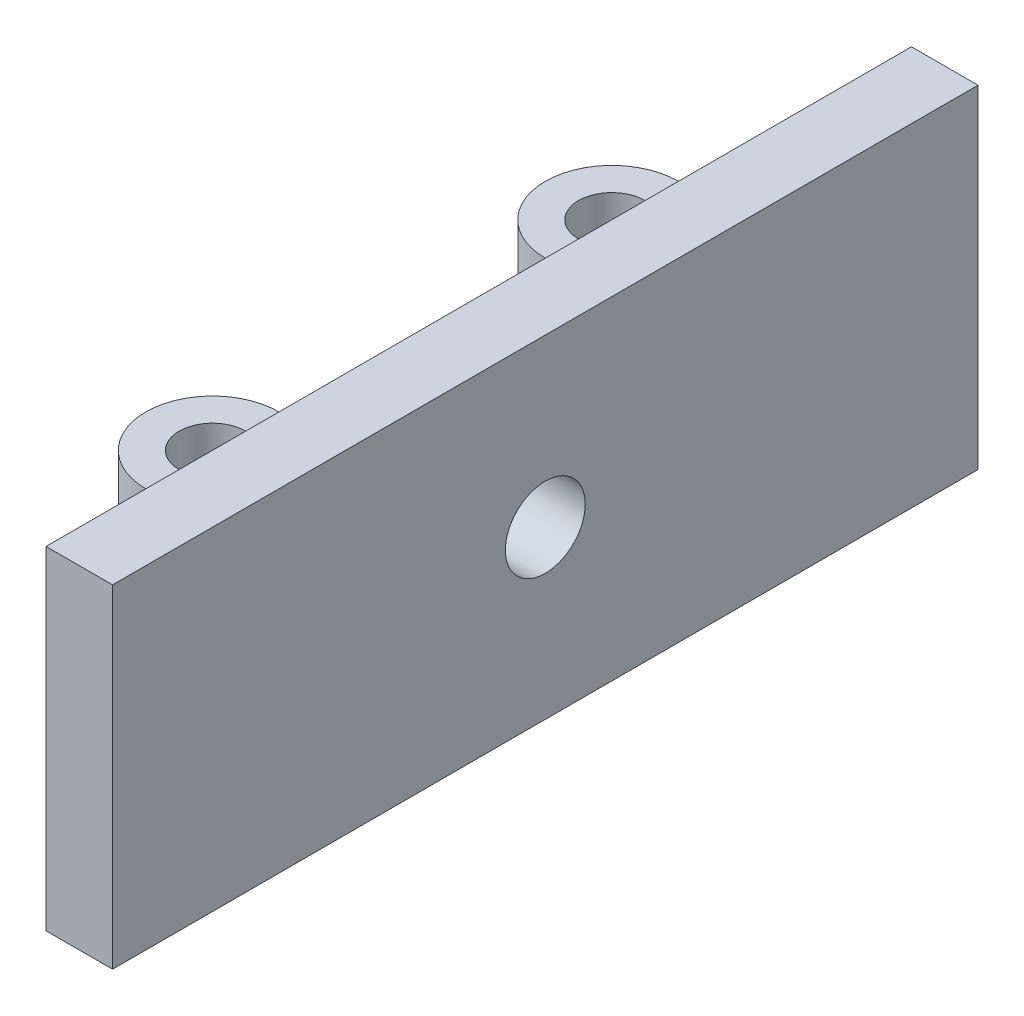
ISO-10303-21;
HEADER;
FILE_DESCRIPTION(('STEP AP214'),'2;1');
FILE_NAME('part.step','',(''),(''),'','','');
FILE_SCHEMA(('AUTOMOTIVE_DESIGN { 1 0 10303 214 1 1 1 1 }'));
ENDSEC;
DATA;
#1=APPLICATION_CONTEXT('core data for automotive mechanical design processes');
#2=APPLICATION_PROTOCOL_DEFINITION('international standard','automotive_design',2000,#1);
#3=PRODUCT_CONTEXT('',#1,'mechanical');
#4=PRODUCT('Part','Part','',(#3));
#5=PRODUCT_RELATED_PRODUCT_CATEGORY('part','',(#4));
#6=PRODUCT_DEFINITION_FORMATION('','',#4);
#7=PRODUCT_DEFINITION_CONTEXT('part definition',#1,'design');
#8=PRODUCT_DEFINITION('design','',#6,#7);
#9=PRODUCT_DEFINITION_SHAPE('','',#8);
#10=(LENGTH_UNIT() NAMED_UNIT(*) SI_UNIT(.MILLI.,.METRE.));
#11=(NAMED_UNIT(*) PLANE_ANGLE_UNIT() SI_UNIT($,.RADIAN.));
#12=(NAMED_UNIT(*) SI_UNIT($,.STERADIAN.) SOLID_ANGLE_UNIT());
#13=UNCERTAINTY_MEASURE_WITH_UNIT(LENGTH_MEASURE(1.E-05),#10,'distance_accuracy_value','');
#14=(GEOMETRIC_REPRESENTATION_CONTEXT(3) GLOBAL_UNCERTAINTY_ASSIGNED_CONTEXT((#13)) GLOBAL_UNIT_ASSIGNED_CONTEXT((#10,
#11,#12)) REPRESENTATION_CONTEXT('',''));
#15=CARTESIAN_POINT('',(0.,0.,0.));
#16=DIRECTION('',(0.,0.,1.));
#17=DIRECTION('',(1.,0.,0.));
#18=AXIS2_PLACEMENT_3D('',#15,#16,#17);
#19=CARTESIAN_POINT('',(-10.,12.5,15.));
#20=DIRECTION('',(0.,1.,0.));
#21=DIRECTION('',(0.,0.,1.));
#22=AXIS2_PLACEMENT_3D('',#19,#20,#21);
#23=PLANE('',#22);
#24=DIRECTION('',(0.,0.,1.));
#25=VECTOR('',#24,1.);
#26=CARTESIAN_POINT('',(-5.,12.5,-32.5));
#27=LINE('',#26,#25);
#28=CARTESIAN_POINT('',(-5.,12.5,-32.5));
#29=VERTEX_POINT('',#28);
#30=CARTESIAN_POINT('',(-4.99999999999999,12.5,32.5));
#31=VERTEX_POINT('',#30);
#32=EDGE_CURVE('E188',#29,#31,#27,.T.);
#33=ORIENTED_EDGE('',*,*,#32,.T.);
#34=DIRECTION('',(1.,0.,0.));
#35=VECTOR('',#34,1.);
#36=CARTESIAN_POINT('',(0.,12.5,32.5));
#37=LINE('',#36,#35);
#38=CARTESIAN_POINT('',(0.,12.5,32.5));
#39=VERTEX_POINT('',#38);
#40=EDGE_CURVE('E190',#31,#39,#37,.T.);
#41=ORIENTED_EDGE('',*,*,#40,.T.);
#42=DIRECTION('',(0.,0.,-1.));
#43=VECTOR('',#42,1.);
#44=CARTESIAN_POINT('',(0.,12.5,-32.5));
#45=LINE('',#44,#43);
#46=CARTESIAN_POINT('',(0.,12.5,-32.5));
#47=VERTEX_POINT('',#46);
#48=EDGE_CURVE('E182',#39,#47,#45,.T.);
#49=ORIENTED_EDGE('',*,*,#48,.T.);
#50=DIRECTION('',(-1.,0.,0.));
#51=VECTOR('',#50,1.);
#52=CARTESIAN_POINT('',(0.,12.5,-32.5));
#53=LINE('',#52,#51);
#54=EDGE_CURVE('E185',#47,#29,#53,.T.);
#55=ORIENTED_EDGE('',*,*,#54,.T.);
#56=EDGE_LOOP('',(#33,#41,#49,#55));
#57=FACE_BOUND('',#56,.T.);
#58=ADVANCED_FACE('F35',(#57),#23,.T.);
#59=CARTESIAN_POINT('',(-10.,-12.5,15.));
#60=DIRECTION('',(0.,1.,0.));
#61=DIRECTION('',(0.,0.,1.));
#62=AXIS2_PLACEMENT_3D('',#59,#60,#61);
#63=PLANE('',#62);
#64=DIRECTION('',(0.,0.,1.));
#65=VECTOR('',#64,1.);
#66=CARTESIAN_POINT('',(-4.99999999999999,-12.5,32.5));
#67=LINE('',#66,#65);
#68=CARTESIAN_POINT('',(-5.,-12.5,-32.5));
#69=VERTEX_POINT('',#68);
#70=CARTESIAN_POINT('',(-4.99999999999999,-12.5,32.5));
#71=VERTEX_POINT('',#70);
#72=EDGE_CURVE('E198',#69,#71,#67,.T.);
#73=ORIENTED_EDGE('',*,*,#72,.F.);
#74=DIRECTION('',(-1.,0.,0.));
#75=VECTOR('',#74,1.);
#76=CARTESIAN_POINT('',(0.,-12.5,-32.5));
#77=LINE('',#76,#75);
#78=CARTESIAN_POINT('',(0.,-12.5,-32.5));
#79=VERTEX_POINT('',#78);
#80=EDGE_CURVE('E195',#79,#69,#77,.T.);
#81=ORIENTED_EDGE('',*,*,#80,.F.);
#82=DIRECTION('',(0.,0.,-1.));
#83=VECTOR('',#82,1.);
#84=CARTESIAN_POINT('',(0.,-12.5,-32.5));
#85=LINE('',#84,#83);
#86=CARTESIAN_POINT('',(0.,-12.5,32.5));
#87=VERTEX_POINT('',#86);
#88=EDGE_CURVE('E181',#87,#79,#85,.T.);
#89=ORIENTED_EDGE('',*,*,#88,.F.);
#90=DIRECTION('',(1.,0.,0.));
#91=VECTOR('',#90,1.);
#92=CARTESIAN_POINT('',(0.,-12.5,32.5));
#93=LINE('',#92,#91);
#94=EDGE_CURVE('E186',#71,#87,#93,.T.);
#95=ORIENTED_EDGE('',*,*,#94,.F.);
#96=EDGE_LOOP('',(#73,#81,#89,#95));
#97=FACE_BOUND('',#96,.T.);
#98=ADVANCED_FACE('F250',(#97),#63,.F.);
#99=CARTESIAN_POINT('',(0.,12.5,-32.5));
#100=DIRECTION('',(-1.,0.,0.));
#101=DIRECTION('',(0.,0.,1.));
#102=AXIS2_PLACEMENT_3D('',#99,#100,#101);
#103=PLANE('',#102);
#104=CARTESIAN_POINT('',(0.,0.,0.));
#105=DIRECTION('',(1.,0.,0.));
#106=DIRECTION('',(0.,0.,-1.));
#107=AXIS2_PLACEMENT_3D('',#104,#105,#106);
#108=CIRCLE('',#107,3.);
#109=CARTESIAN_POINT('',(0.,0.,-3.));
#110=VERTEX_POINT('',#109);
#111=EDGE_CURVE('E241',#110,#110,#108,.T.);
#112=ORIENTED_EDGE('',*,*,#111,.F.);
#113=EDGE_LOOP('',(#112));
#114=FACE_BOUND('',#113,.T.);
#115=ORIENTED_EDGE('',*,*,#88,.T.);
#116=DIRECTION('',(0.,-1.,0.));
#117=VECTOR('',#116,1.);
#118=CARTESIAN_POINT('',(0.,12.5,-32.5));
#119=LINE('',#118,#117);
#120=EDGE_CURVE('E11',#47,#79,#119,.T.);
#121=ORIENTED_EDGE('',*,*,#120,.F.);
#122=ORIENTED_EDGE('',*,*,#48,.F.);
#123=DIRECTION('',(0.,-1.,0.));
#124=VECTOR('',#123,1.);
#125=CARTESIAN_POINT('',(0.,12.5,32.5));
#126=LINE('',#125,#124);
#127=EDGE_CURVE('E192',#39,#87,#126,.T.);
#128=ORIENTED_EDGE('',*,*,#127,.T.);
#129=EDGE_LOOP('',(#115,#121,#122,#128));
#130=FACE_BOUND('',#129,.T.);
#131=ADVANCED_FACE('F37',(#114,#130),#103,.F.);
#132=CARTESIAN_POINT('',(0.,12.5,-32.5));
#133=DIRECTION('',(0.,0.,1.));
#134=DIRECTION('',(1.,0.,0.));
#135=AXIS2_PLACEMENT_3D('',#132,#133,#134);
#136=PLANE('',#135);
#137=ORIENTED_EDGE('',*,*,#80,.T.);
#138=DIRECTION('',(0.,-1.,0.));
#139=VECTOR('',#138,1.);
#140=CARTESIAN_POINT('',(-5.,12.5,-32.5));
#141=LINE('',#140,#139);
#142=EDGE_CURVE('E44',#29,#69,#141,.T.);
#143=ORIENTED_EDGE('',*,*,#142,.F.);
#144=ORIENTED_EDGE('',*,*,#54,.F.);
#145=ORIENTED_EDGE('',*,*,#120,.T.);
#146=EDGE_LOOP('',(#137,#143,#144,#145));
#147=FACE_BOUND('',#146,.T.);
#148=ADVANCED_FACE('F249',(#147),#136,.F.);
#149=CARTESIAN_POINT('',(-10.,12.5,-20.));
#150=DIRECTION('',(0.,0.,1.));
#151=DIRECTION('',(1.,0.,0.));
#152=AXIS2_PLACEMENT_3D('',#149,#150,#151);
#153=PLANE('',#152);
#154=DIRECTION('',(0.,-1.,0.));
#155=VECTOR('',#154,1.);
#156=CARTESIAN_POINT('',(-5.,12.5,-20.));
#157=LINE('',#156,#155);
#158=CARTESIAN_POINT('',(-4.99999999999999,7.5,-20.));
#159=VERTEX_POINT('',#158);
#160=CARTESIAN_POINT('',(-4.99999999999999,-7.5,-20.));
#161=VERTEX_POINT('',#160);
#162=EDGE_CURVE('E144',#159,#161,#157,.T.);
#163=ORIENTED_EDGE('',*,*,#162,.T.);
#164=DIRECTION('',(-1.,0.,0.));
#165=VECTOR('',#164,1.);
#166=CARTESIAN_POINT('',(-10.,-7.5,-20.));
#167=LINE('',#166,#165);
#168=CARTESIAN_POINT('',(-10.,-7.5,-20.));
#169=VERTEX_POINT('',#168);
#170=EDGE_CURVE('E125',#161,#169,#167,.T.);
#171=ORIENTED_EDGE('',*,*,#170,.T.);
#172=DIRECTION('',(0.,-1.,0.));
#173=VECTOR('',#172,1.);
#174=CARTESIAN_POINT('',(-10.,12.5,-20.));
#175=LINE('',#174,#173);
#176=CARTESIAN_POINT('',(-10.,7.5,-20.));
#177=VERTEX_POINT('',#176);
#178=EDGE_CURVE('E152',#177,#169,#175,.T.);
#179=ORIENTED_EDGE('',*,*,#178,.F.);
#180=DIRECTION('',(1.,0.,0.));
#181=VECTOR('',#180,1.);
#182=CARTESIAN_POINT('',(-10.,7.5,-20.));
#183=LINE('',#182,#181);
#184=EDGE_CURVE('E151',#177,#159,#183,.T.);
#185=ORIENTED_EDGE('',*,*,#184,.T.);
#186=EDGE_LOOP('',(#163,#171,#179,#185));
#187=FACE_BOUND('',#186,.T.);
#188=ADVANCED_FACE('F150',(#187),#153,.F.);
#189=CARTESIAN_POINT('',(-10.,12.5,-15.));
#190=DIRECTION('',(0.,-1.,0.));
#191=DIRECTION('',(0.,0.,-1.));
#192=AXIS2_PLACEMENT_3D('',#189,#190,#191);
#193=CYLINDRICAL_SURFACE('',#192,5.);
#194=ORIENTED_EDGE('',*,*,#178,.T.);
#195=CARTESIAN_POINT('',(-10.,-7.5,-15.));
#196=DIRECTION('',(0.,1.,0.));
#197=DIRECTION('',(0.,0.,1.));
#198=AXIS2_PLACEMENT_3D('',#195,#196,#197);
#199=CIRCLE('',#198,5.);
#200=CARTESIAN_POINT('',(-10.,-7.5,-10.));
#201=VERTEX_POINT('',#200);
#202=EDGE_CURVE('E131',#169,#201,#199,.T.);
#203=ORIENTED_EDGE('',*,*,#202,.T.);
#204=DIRECTION('',(0.,-1.,0.));
#205=VECTOR('',#204,1.);
#206=CARTESIAN_POINT('',(-10.,12.5,-10.));
#207=LINE('',#206,#205);
#208=CARTESIAN_POINT('',(-10.,7.5,-10.));
#209=VERTEX_POINT('',#208);
#210=EDGE_CURVE('E156',#209,#201,#207,.T.);
#211=ORIENTED_EDGE('',*,*,#210,.F.);
#212=CARTESIAN_POINT('',(-10.,7.5,-15.));
#213=DIRECTION('',(0.,-1.,0.));
#214=DIRECTION('',(0.,0.,-1.));
#215=AXIS2_PLACEMENT_3D('',#212,#213,#214);
#216=CIRCLE('',#215,5.);
#217=EDGE_CURVE('E52',#209,#177,#216,.T.);
#218=ORIENTED_EDGE('',*,*,#217,.T.);
#219=EDGE_LOOP('',(#194,#203,#211,#218));
#220=FACE_BOUND('',#219,.T.);
#221=ADVANCED_FACE('F224',(#220),#193,.T.);
#222=CARTESIAN_POINT('',(-10.,12.5,-10.));
#223=DIRECTION('',(0.,0.,-1.));
#224=DIRECTION('',(-1.,0.,0.));
#225=AXIS2_PLACEMENT_3D('',#222,#223,#224);
#226=PLANE('',#225);
#227=ORIENTED_EDGE('',*,*,#210,.T.);
#228=DIRECTION('',(1.,0.,0.));
#229=VECTOR('',#228,1.);
#230=CARTESIAN_POINT('',(-10.,-7.5,-10.));
#231=LINE('',#230,#229);
#232=CARTESIAN_POINT('',(-4.99999999999999,-7.5,-9.99999999999999));
#233=VERTEX_POINT('',#232);
#234=EDGE_CURVE('E222',#201,#233,#231,.T.);
#235=ORIENTED_EDGE('',*,*,#234,.T.);
#236=DIRECTION('',(0.,-1.,0.));
#237=VECTOR('',#236,1.);
#238=CARTESIAN_POINT('',(-5.,12.5,-10.));
#239=LINE('',#238,#237);
#240=CARTESIAN_POINT('',(-4.99999999999999,7.5,-10.));
#241=VERTEX_POINT('',#240);
#242=EDGE_CURVE('E146',#241,#233,#239,.T.);
#243=ORIENTED_EDGE('',*,*,#242,.F.);
#244=DIRECTION('',(-1.,0.,0.));
#245=VECTOR('',#244,1.);
#246=CARTESIAN_POINT('',(-10.,7.5,-10.));
#247=LINE('',#246,#245);
#248=EDGE_CURVE('E177',#241,#209,#247,.T.);
#249=ORIENTED_EDGE('',*,*,#248,.T.);
#250=EDGE_LOOP('',(#227,#235,#243,#249));
#251=FACE_BOUND('',#250,.T.);
#252=ADVANCED_FACE('F221',(#251),#226,.F.);
#253=CARTESIAN_POINT('',(-10.,12.5,10.));
#254=DIRECTION('',(0.,0.,1.));
#255=DIRECTION('',(1.,0.,0.));
#256=AXIS2_PLACEMENT_3D('',#253,#254,#255);
#257=PLANE('',#256);
#258=DIRECTION('',(0.,-1.,0.));
#259=VECTOR('',#258,1.);
#260=CARTESIAN_POINT('',(-4.99999999999999,12.5,10.));
#261=LINE('',#260,#259);
#262=CARTESIAN_POINT('',(-4.99999999999999,7.5,9.99999999999999));
#263=VERTEX_POINT('',#262);
#264=CARTESIAN_POINT('',(-4.99999999999999,-7.5,9.99999999999999));
#265=VERTEX_POINT('',#264);
#266=EDGE_CURVE('E215',#263,#265,#261,.T.);
#267=ORIENTED_EDGE('',*,*,#266,.T.);
#268=DIRECTION('',(-1.,0.,0.));
#269=VECTOR('',#268,1.);
#270=CARTESIAN_POINT('',(-10.,-7.5,10.));
#271=LINE('',#270,#269);
#272=CARTESIAN_POINT('',(-10.,-7.5,10.));
#273=VERTEX_POINT('',#272);
#274=EDGE_CURVE('E225',#265,#273,#271,.T.);
#275=ORIENTED_EDGE('',*,*,#274,.T.);
#276=DIRECTION('',(0.,-1.,0.));
#277=VECTOR('',#276,1.);
#278=CARTESIAN_POINT('',(-10.,12.5,10.));
#279=LINE('',#278,#277);
#280=CARTESIAN_POINT('',(-10.,7.5,10.));
#281=VERTEX_POINT('',#280);
#282=EDGE_CURVE('E212',#281,#273,#279,.T.);
#283=ORIENTED_EDGE('',*,*,#282,.F.);
#284=DIRECTION('',(1.,0.,0.));
#285=VECTOR('',#284,1.);
#286=CARTESIAN_POINT('',(-10.,7.5,10.));
#287=LINE('',#286,#285);
#288=EDGE_CURVE('E174',#281,#263,#287,.T.);
#289=ORIENTED_EDGE('',*,*,#288,.T.);
#290=EDGE_LOOP('',(#267,#275,#283,#289));
#291=FACE_BOUND('',#290,.T.);
#292=ADVANCED_FACE('F355',(#291),#257,.F.);
#293=CARTESIAN_POINT('',(-10.,12.5,15.));
#294=DIRECTION('',(0.,-1.,0.));
#295=DIRECTION('',(0.,0.,-1.));
#296=AXIS2_PLACEMENT_3D('',#293,#294,#295);
#297=CYLINDRICAL_SURFACE('',#296,5.);
#298=ORIENTED_EDGE('',*,*,#282,.T.);
#299=CARTESIAN_POINT('',(-10.,-7.5,15.));
#300=DIRECTION('',(0.,1.,0.));
#301=DIRECTION('',(0.,0.,1.));
#302=AXIS2_PLACEMENT_3D('',#299,#300,#301);
#303=CIRCLE('',#302,5.);
#304=CARTESIAN_POINT('',(-10.,-7.5,20.));
#305=VERTEX_POINT('',#304);
#306=EDGE_CURVE('E228',#273,#305,#303,.T.);
#307=ORIENTED_EDGE('',*,*,#306,.T.);
#308=DIRECTION('',(0.,-1.,0.));
#309=VECTOR('',#308,1.);
#310=CARTESIAN_POINT('',(-10.,12.5,20.));
#311=LINE('',#310,#309);
#312=CARTESIAN_POINT('',(-10.,7.5,20.));
#313=VERTEX_POINT('',#312);
#314=EDGE_CURVE('E209',#313,#305,#311,.T.);
#315=ORIENTED_EDGE('',*,*,#314,.F.);
#316=CARTESIAN_POINT('',(-10.,7.5,15.));
#317=DIRECTION('',(0.,-1.,0.));
#318=DIRECTION('',(0.,0.,-1.));
#319=AXIS2_PLACEMENT_3D('',#316,#317,#318);
#320=CIRCLE('',#319,5.);
#321=EDGE_CURVE('E60',#313,#281,#320,.T.);
#322=ORIENTED_EDGE('',*,*,#321,.T.);
#323=EDGE_LOOP('',(#298,#307,#315,#322));
#324=FACE_BOUND('',#323,.T.);
#325=ADVANCED_FACE('F276',(#324),#297,.T.);
#326=CARTESIAN_POINT('',(-10.,12.5,20.));
#327=DIRECTION('',(0.,0.,-1.));
#328=DIRECTION('',(-1.,0.,0.));
#329=AXIS2_PLACEMENT_3D('',#326,#327,#328);
#330=PLANE('',#329);
#331=ORIENTED_EDGE('',*,*,#314,.T.);
#332=DIRECTION('',(1.,0.,0.));
#333=VECTOR('',#332,1.);
#334=CARTESIAN_POINT('',(-10.,-7.5,20.));
#335=LINE('',#334,#333);
#336=CARTESIAN_POINT('',(-4.99999999999999,-7.5,20.));
#337=VERTEX_POINT('',#336);
#338=EDGE_CURVE('E232',#305,#337,#335,.T.);
#339=ORIENTED_EDGE('',*,*,#338,.T.);
#340=DIRECTION('',(0.,-1.,0.));
#341=VECTOR('',#340,1.);
#342=CARTESIAN_POINT('',(-4.99999999999999,12.5,20.));
#343=LINE('',#342,#341);
#344=CARTESIAN_POINT('',(-4.99999999999999,7.5,20.));
#345=VERTEX_POINT('',#344);
#346=EDGE_CURVE('E206',#345,#337,#343,.T.);
#347=ORIENTED_EDGE('',*,*,#346,.F.);
#348=DIRECTION('',(-1.,0.,0.));
#349=VECTOR('',#348,1.);
#350=CARTESIAN_POINT('',(-10.,7.5,20.));
#351=LINE('',#350,#349);
#352=EDGE_CURVE('E166',#345,#313,#351,.T.);
#353=ORIENTED_EDGE('',*,*,#352,.T.);
#354=EDGE_LOOP('',(#331,#339,#347,#353));
#355=FACE_BOUND('',#354,.T.);
#356=ADVANCED_FACE('F267',(#355),#330,.F.);
#357=CARTESIAN_POINT('',(-4.99999999999999,12.5,32.5));
#358=DIRECTION('',(1.,0.,0.));
#359=DIRECTION('',(0.,0.,-1.));
#360=AXIS2_PLACEMENT_3D('',#357,#358,#359);
#361=PLANE('',#360);
#362=CARTESIAN_POINT('',(-4.99999999999999,0.,0.));
#363=DIRECTION('',(1.,0.,0.));
#364=DIRECTION('',(0.,0.,-1.));
#365=AXIS2_PLACEMENT_3D('',#362,#363,#364);
#366=CIRCLE('',#365,3.);
#367=CARTESIAN_POINT('',(-4.99999999999999,0.,-3.));
#368=VERTEX_POINT('',#367);
#369=EDGE_CURVE('E238',#368,#368,#366,.T.);
#370=ORIENTED_EDGE('',*,*,#369,.T.);
#371=EDGE_LOOP('',(#370));
#372=FACE_BOUND('',#371,.T.);
#373=DIRECTION('',(0.,0.,1.));
#374=VECTOR('',#373,1.);
#375=CARTESIAN_POINT('',(-4.99999999999999,-7.5,-32.5));
#376=LINE('',#375,#374);
#377=EDGE_CURVE('E129',#161,#233,#376,.T.);
#378=ORIENTED_EDGE('',*,*,#377,.F.);
#379=ORIENTED_EDGE('',*,*,#162,.F.);
#380=DIRECTION('',(0.,0.,1.));
#381=VECTOR('',#380,1.);
#382=CARTESIAN_POINT('',(-4.99999999999999,7.5,-32.5));
#383=LINE('',#382,#381);
#384=EDGE_CURVE('E162',#159,#241,#383,.T.);
#385=ORIENTED_EDGE('',*,*,#384,.T.);
#386=ORIENTED_EDGE('',*,*,#242,.T.);
#387=EDGE_LOOP('',(#378,#379,#385,#386));
#388=FACE_BOUND('',#387,.T.);
#389=EDGE_CURVE('E147',#265,#337,#376,.T.);
#390=ORIENTED_EDGE('',*,*,#389,.F.);
#391=ORIENTED_EDGE('',*,*,#266,.F.);
#392=EDGE_CURVE('E136',#263,#345,#383,.T.);
#393=ORIENTED_EDGE('',*,*,#392,.T.);
#394=ORIENTED_EDGE('',*,*,#346,.T.);
#395=EDGE_LOOP('',(#390,#391,#393,#394));
#396=FACE_BOUND('',#395,.T.);
#397=ORIENTED_EDGE('',*,*,#142,.T.);
#398=ORIENTED_EDGE('',*,*,#72,.T.);
#399=DIRECTION('',(0.,-1.,0.));
#400=VECTOR('',#399,1.);
#401=CARTESIAN_POINT('',(-4.99999999999999,12.5,32.5));
#402=LINE('',#401,#400);
#403=EDGE_CURVE('E204',#31,#71,#402,.T.);
#404=ORIENTED_EDGE('',*,*,#403,.F.);
#405=ORIENTED_EDGE('',*,*,#32,.F.);
#406=EDGE_LOOP('',(#397,#398,#404,#405));
#407=FACE_BOUND('',#406,.T.);
#408=ADVANCED_FACE('F141',(#372,#388,#396,#407),#361,.F.);
#409=CARTESIAN_POINT('',(0.,12.5,32.5));
#410=DIRECTION('',(0.,0.,-1.));
#411=DIRECTION('',(-1.,0.,0.));
#412=AXIS2_PLACEMENT_3D('',#409,#410,#411);
#413=PLANE('',#412);
#414=ORIENTED_EDGE('',*,*,#94,.T.);
#415=ORIENTED_EDGE('',*,*,#127,.F.);
#416=ORIENTED_EDGE('',*,*,#40,.F.);
#417=ORIENTED_EDGE('',*,*,#403,.T.);
#418=EDGE_LOOP('',(#414,#415,#416,#417));
#419=FACE_BOUND('',#418,.T.);
#420=ADVANCED_FACE('F264',(#419),#413,.F.);
#421=CARTESIAN_POINT('',(-10.,12.5,-15.));
#422=DIRECTION('',(0.,-1.,0.));
#423=DIRECTION('',(0.,0.,-1.));
#424=AXIS2_PLACEMENT_3D('',#421,#422,#423);
#425=CYLINDRICAL_SURFACE('',#424,2.5);
#426=CARTESIAN_POINT('',(-10.,-7.5,-15.));
#427=DIRECTION('',(0.,1.,0.));
#428=DIRECTION('',(0.,0.,1.));
#429=AXIS2_PLACEMENT_3D('',#426,#427,#428);
#430=CIRCLE('',#429,2.5);
#431=CARTESIAN_POINT('',(-10.,-7.5,-12.5));
#432=VERTEX_POINT('',#431);
#433=EDGE_CURVE('E235',#432,#432,#430,.T.);
#434=ORIENTED_EDGE('',*,*,#433,.F.);
#435=EDGE_LOOP('',(#434));
#436=FACE_BOUND('',#435,.T.);
#437=CARTESIAN_POINT('',(-10.,7.5,-15.));
#438=DIRECTION('',(0.,-1.,0.));
#439=DIRECTION('',(0.,0.,-1.));
#440=AXIS2_PLACEMENT_3D('',#437,#438,#439);
#441=CIRCLE('',#440,2.5);
#442=CARTESIAN_POINT('',(-10.,7.5,-17.5));
#443=VERTEX_POINT('',#442);
#444=EDGE_CURVE('E161',#443,#443,#441,.T.);
#445=ORIENTED_EDGE('',*,*,#444,.F.);
#446=EDGE_LOOP('',(#445));
#447=FACE_BOUND('',#446,.T.);
#448=ADVANCED_FACE('F274',(#436,#447),#425,.F.);
#449=CARTESIAN_POINT('',(-10.,12.5,15.));
#450=DIRECTION('',(0.,-1.,0.));
#451=DIRECTION('',(0.,0.,-1.));
#452=AXIS2_PLACEMENT_3D('',#449,#450,#451);
#453=CYLINDRICAL_SURFACE('',#452,2.5);
#454=CARTESIAN_POINT('',(-10.,-7.5,15.));
#455=DIRECTION('',(0.,1.,0.));
#456=DIRECTION('',(0.,0.,1.));
#457=AXIS2_PLACEMENT_3D('',#454,#455,#456);
#458=CIRCLE('',#457,2.5);
#459=CARTESIAN_POINT('',(-10.,-7.5,17.5));
#460=VERTEX_POINT('',#459);
#461=EDGE_CURVE('E39',#460,#460,#458,.T.);
#462=ORIENTED_EDGE('',*,*,#461,.F.);
#463=EDGE_LOOP('',(#462));
#464=FACE_BOUND('',#463,.T.);
#465=CARTESIAN_POINT('',(-10.,7.5,15.));
#466=DIRECTION('',(0.,-1.,0.));
#467=DIRECTION('',(0.,0.,-1.));
#468=AXIS2_PLACEMENT_3D('',#465,#466,#467);
#469=CIRCLE('',#468,2.5);
#470=CARTESIAN_POINT('',(-10.,7.5,12.5));
#471=VERTEX_POINT('',#470);
#472=EDGE_CURVE('E159',#471,#471,#469,.T.);
#473=ORIENTED_EDGE('',*,*,#472,.F.);
#474=EDGE_LOOP('',(#473));
#475=FACE_BOUND('',#474,.T.);
#476=ADVANCED_FACE('F288',(#464,#475),#453,.F.);
#477=CARTESIAN_POINT('',(-15.,7.5,-32.5));
#478=DIRECTION('',(0.,-1.,0.));
#479=DIRECTION('',(0.,0.,-1.));
#480=AXIS2_PLACEMENT_3D('',#477,#478,#479);
#481=PLANE('',#480);
#482=ORIENTED_EDGE('',*,*,#472,.T.);
#483=EDGE_LOOP('',(#482));
#484=FACE_BOUND('',#483,.T.);
#485=ORIENTED_EDGE('',*,*,#321,.F.);
#486=ORIENTED_EDGE('',*,*,#352,.F.);
#487=ORIENTED_EDGE('',*,*,#392,.F.);
#488=ORIENTED_EDGE('',*,*,#288,.F.);
#489=EDGE_LOOP('',(#485,#486,#487,#488));
#490=FACE_BOUND('',#489,.T.);
#491=ADVANCED_FACE('F292',(#484,#490),#481,.F.);
#492=ORIENTED_EDGE('',*,*,#444,.T.);
#493=EDGE_LOOP('',(#492));
#494=FACE_BOUND('',#493,.T.);
#495=ORIENTED_EDGE('',*,*,#217,.F.);
#496=ORIENTED_EDGE('',*,*,#248,.F.);
#497=ORIENTED_EDGE('',*,*,#384,.F.);
#498=ORIENTED_EDGE('',*,*,#184,.F.);
#499=EDGE_LOOP('',(#495,#496,#497,#498));
#500=FACE_BOUND('',#499,.T.);
#501=ADVANCED_FACE('F294',(#494,#500),#481,.F.);
#502=CARTESIAN_POINT('',(-15.,-7.5,-32.5));
#503=DIRECTION('',(0.,1.,0.));
#504=DIRECTION('',(0.,0.,1.));
#505=AXIS2_PLACEMENT_3D('',#502,#503,#504);
#506=PLANE('',#505);
#507=ORIENTED_EDGE('',*,*,#461,.T.);
#508=EDGE_LOOP('',(#507));
#509=FACE_BOUND('',#508,.T.);
#510=ORIENTED_EDGE('',*,*,#389,.T.);
#511=ORIENTED_EDGE('',*,*,#338,.F.);
#512=ORIENTED_EDGE('',*,*,#306,.F.);
#513=ORIENTED_EDGE('',*,*,#274,.F.);
#514=EDGE_LOOP('',(#510,#511,#512,#513));
#515=FACE_BOUND('',#514,.T.);
#516=ADVANCED_FACE('F297',(#509,#515),#506,.F.);
#517=ORIENTED_EDGE('',*,*,#433,.T.);
#518=EDGE_LOOP('',(#517));
#519=FACE_BOUND('',#518,.T.);
#520=ORIENTED_EDGE('',*,*,#377,.T.);
#521=ORIENTED_EDGE('',*,*,#234,.F.);
#522=ORIENTED_EDGE('',*,*,#202,.F.);
#523=ORIENTED_EDGE('',*,*,#170,.F.);
#524=EDGE_LOOP('',(#520,#521,#522,#523));
#525=FACE_BOUND('',#524,.T.);
#526=ADVANCED_FACE('F127',(#519,#525),#506,.F.);
#527=CARTESIAN_POINT('',(0.,0.,0.));
#528=DIRECTION('',(1.,0.,0.));
#529=DIRECTION('',(0.,0.,-1.));
#530=AXIS2_PLACEMENT_3D('',#527,#528,#529);
#531=CYLINDRICAL_SURFACE('',#530,3.);
#532=ORIENTED_EDGE('',*,*,#369,.F.);
#533=EDGE_LOOP('',(#532));
#534=FACE_BOUND('',#533,.T.);
#535=ORIENTED_EDGE('',*,*,#111,.T.);
#536=EDGE_LOOP('',(#535));
#537=FACE_BOUND('',#536,.T.);
#538=ADVANCED_FACE('F245',(#534,#537),#531,.F.);
#539=CLOSED_SHELL('',(#58,#98,#131,#148,#188,#221,#252,#292,#325,#356,#408,#420,#448,#476,#491,
#501,#516,#526,#538));
#540=MANIFOLD_SOLID_BREP('B2',#539);
#541=ADVANCED_BREP_SHAPE_REPRESENTATION('',(#18,#540),#14);
#542=SHAPE_DEFINITION_REPRESENTATION(#9,#541);
ENDSEC;
END-ISO-10303-21;
